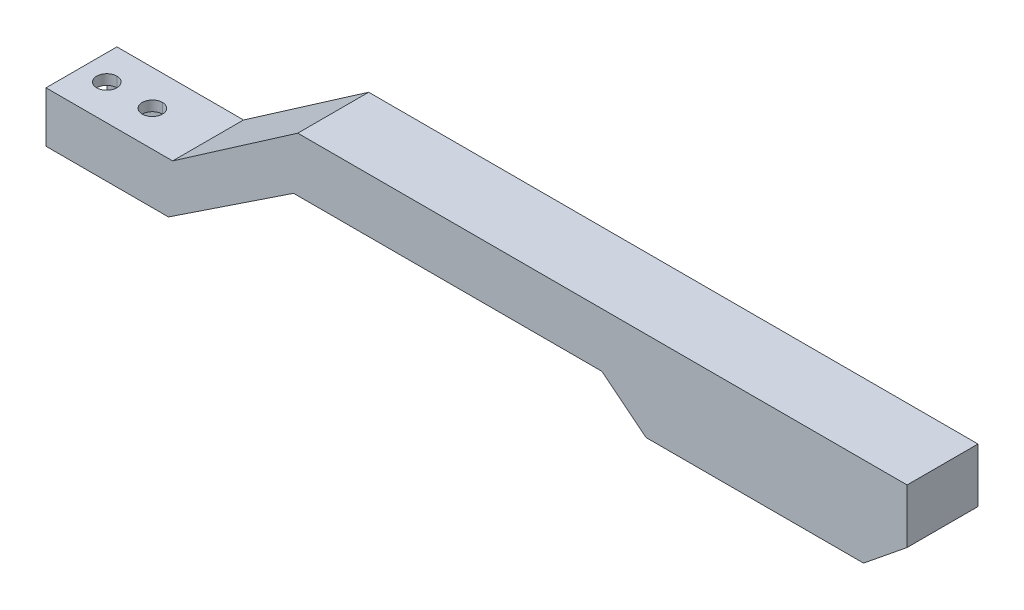
ISO-10303-21;
HEADER;
FILE_DESCRIPTION(('STEP AP214'),'2;1');
FILE_NAME('part.step','',(''),(''),'','','');
FILE_SCHEMA(('AUTOMOTIVE_DESIGN { 1 0 10303 214 1 1 1 1 }'));
ENDSEC;
DATA;
#1=APPLICATION_CONTEXT('core data for automotive mechanical design processes');
#2=APPLICATION_PROTOCOL_DEFINITION('international standard','automotive_design',2000,#1);
#3=PRODUCT_CONTEXT('',#1,'mechanical');
#4=PRODUCT('Part','Part','',(#3));
#5=PRODUCT_RELATED_PRODUCT_CATEGORY('part','',(#4));
#6=PRODUCT_DEFINITION_FORMATION('','',#4);
#7=PRODUCT_DEFINITION_CONTEXT('part definition',#1,'design');
#8=PRODUCT_DEFINITION('design','',#6,#7);
#9=PRODUCT_DEFINITION_SHAPE('','',#8);
#10=(LENGTH_UNIT() NAMED_UNIT(*) SI_UNIT(.MILLI.,.METRE.));
#11=(NAMED_UNIT(*) PLANE_ANGLE_UNIT() SI_UNIT($,.RADIAN.));
#12=(NAMED_UNIT(*) SI_UNIT($,.STERADIAN.) SOLID_ANGLE_UNIT());
#13=UNCERTAINTY_MEASURE_WITH_UNIT(LENGTH_MEASURE(1.E-05),#10,'distance_accuracy_value','');
#14=(GEOMETRIC_REPRESENTATION_CONTEXT(3) GLOBAL_UNCERTAINTY_ASSIGNED_CONTEXT((#13)) GLOBAL_UNIT_ASSIGNED_CONTEXT((#10,
#11,#12)) REPRESENTATION_CONTEXT('',''));
#15=CARTESIAN_POINT('',(0.,0.,0.));
#16=DIRECTION('',(0.,0.,1.));
#17=DIRECTION('',(1.,0.,0.));
#18=AXIS2_PLACEMENT_3D('',#15,#16,#17);
#19=CARTESIAN_POINT('',(-29.6828127219875,20.3064149639241,7.));
#20=DIRECTION('',(0.,1.,0.));
#21=DIRECTION('',(0.,0.,1.));
#22=AXIS2_PLACEMENT_3D('',#19,#20,#21);
#23=CYLINDRICAL_SURFACE('',#22,2.);
#24=DIRECTION('',(0.,1.,0.));
#25=VECTOR('',#24,1.);
#26=CARTESIAN_POINT('',(-29.6828127219875,20.3064149639241,5.));
#27=LINE('',#26,#25);
#28=CARTESIAN_POINT('',(-29.6828127219875,40.3064149639241,5.));
#29=VERTEX_POINT('',#28);
#30=CARTESIAN_POINT('',(-29.6828127219875,42.3064149639241,5.));
#31=VERTEX_POINT('',#30);
#32=EDGE_CURVE('E391',#29,#31,#27,.T.);
#33=ORIENTED_EDGE('',*,*,#32,.F.);
#34=CARTESIAN_POINT('',(-29.6828127219875,40.3064149639241,7.));
#35=DIRECTION('',(0.,1.,0.));
#36=DIRECTION('',(0.,0.,1.));
#37=AXIS2_PLACEMENT_3D('',#34,#35,#36);
#38=CIRCLE('',#37,2.);
#39=CARTESIAN_POINT('',(-29.6828127219875,40.3064149639241,9.));
#40=VERTEX_POINT('',#39);
#41=EDGE_CURVE('E290',#40,#29,#38,.T.);
#42=ORIENTED_EDGE('',*,*,#41,.F.);
#43=DIRECTION('',(0.,1.,0.));
#44=VECTOR('',#43,1.);
#45=CARTESIAN_POINT('',(-29.6828127219875,20.3064149639241,9.));
#46=LINE('',#45,#44);
#47=CARTESIAN_POINT('',(-29.6828127219875,42.3064149639241,9.));
#48=VERTEX_POINT('',#47);
#49=EDGE_CURVE('E380',#40,#48,#46,.T.);
#50=ORIENTED_EDGE('',*,*,#49,.T.);
#51=CARTESIAN_POINT('',(-29.6828127219875,42.3064149639241,7.));
#52=DIRECTION('',(0.,1.,0.));
#53=DIRECTION('',(0.,0.,1.));
#54=AXIS2_PLACEMENT_3D('',#51,#52,#53);
#55=CIRCLE('',#54,2.);
#56=EDGE_CURVE('E254',#48,#31,#55,.T.);
#57=ORIENTED_EDGE('',*,*,#56,.T.);
#58=EDGE_LOOP('',(#33,#42,#50,#57));
#59=FACE_BOUND('',#58,.T.);
#60=ADVANCED_FACE('F16',(#59),#23,.F.);
#61=CARTESIAN_POINT('',(-20.6828127219875,20.3064149639241,7.));
#62=DIRECTION('',(0.,1.,0.));
#63=DIRECTION('',(0.,0.,1.));
#64=AXIS2_PLACEMENT_3D('',#61,#62,#63);
#65=CYLINDRICAL_SURFACE('',#64,2.);
#66=DIRECTION('',(0.,1.,0.));
#67=VECTOR('',#66,1.);
#68=CARTESIAN_POINT('',(-20.6828127219875,20.3064149639241,5.));
#69=LINE('',#68,#67);
#70=CARTESIAN_POINT('',(-20.6828127219875,40.3064149639241,5.));
#71=VERTEX_POINT('',#70);
#72=CARTESIAN_POINT('',(-20.6828127219875,42.3064149639241,5.));
#73=VERTEX_POINT('',#72);
#74=EDGE_CURVE('E367',#71,#73,#69,.T.);
#75=ORIENTED_EDGE('',*,*,#74,.F.);
#76=CARTESIAN_POINT('',(-20.6828127219875,40.3064149639241,7.));
#77=DIRECTION('',(0.,1.,0.));
#78=DIRECTION('',(0.,0.,1.));
#79=AXIS2_PLACEMENT_3D('',#76,#77,#78);
#80=CIRCLE('',#79,2.);
#81=CARTESIAN_POINT('',(-20.6828127219875,40.3064149639241,9.));
#82=VERTEX_POINT('',#81);
#83=EDGE_CURVE('E25',#82,#71,#80,.T.);
#84=ORIENTED_EDGE('',*,*,#83,.F.);
#85=DIRECTION('',(0.,1.,0.));
#86=VECTOR('',#85,1.);
#87=CARTESIAN_POINT('',(-20.6828127219875,20.3064149639241,9.));
#88=LINE('',#87,#86);
#89=CARTESIAN_POINT('',(-20.6828127219875,42.3064149639241,9.));
#90=VERTEX_POINT('',#89);
#91=EDGE_CURVE('E218',#82,#90,#88,.T.);
#92=ORIENTED_EDGE('',*,*,#91,.T.);
#93=CARTESIAN_POINT('',(-20.6828127219875,42.3064149639241,7.));
#94=DIRECTION('',(0.,1.,0.));
#95=DIRECTION('',(0.,0.,1.));
#96=AXIS2_PLACEMENT_3D('',#93,#94,#95);
#97=CIRCLE('',#96,2.);
#98=EDGE_CURVE('E257',#90,#73,#97,.T.);
#99=ORIENTED_EDGE('',*,*,#98,.T.);
#100=EDGE_LOOP('',(#75,#84,#92,#99));
#101=FACE_BOUND('',#100,.T.);
#102=ADVANCED_FACE('F443',(#101),#65,.F.);
#103=CARTESIAN_POINT('',(-12.6828127219875,0.,0.));
#104=DIRECTION('',(1.,0.,0.));
#105=DIRECTION('',(0.,1.,0.));
#106=AXIS2_PLACEMENT_3D('',#103,#104,#105);
#107=PLANE('',#106);
#108=DIRECTION('',(0.,-1.,0.));
#109=VECTOR('',#108,1.);
#110=CARTESIAN_POINT('',(-12.6828127219875,32.3064149639241,2.));
#111=LINE('',#110,#109);
#112=CARTESIAN_POINT('',(-12.6828127219875,40.3064149639241,2.));
#113=VERTEX_POINT('',#112);
#114=CARTESIAN_POINT('',(-12.6828127219875,32.3064149639241,2.));
#115=VERTEX_POINT('',#114);
#116=EDGE_CURVE('E268',#113,#115,#111,.T.);
#117=ORIENTED_EDGE('',*,*,#116,.T.);
#118=DIRECTION('',(0.,0.,1.));
#119=VECTOR('',#118,1.);
#120=CARTESIAN_POINT('',(-12.6828127219875,32.3064149639241,2.));
#121=LINE('',#120,#119);
#122=CARTESIAN_POINT('',(-12.6828127219875,32.3064149639241,12.));
#123=VERTEX_POINT('',#122);
#124=EDGE_CURVE('E301',#115,#123,#121,.T.);
#125=ORIENTED_EDGE('',*,*,#124,.T.);
#126=DIRECTION('',(0.,1.,0.));
#127=VECTOR('',#126,1.);
#128=CARTESIAN_POINT('',(-12.6828127219875,40.3064149639241,12.));
#129=LINE('',#128,#127);
#130=CARTESIAN_POINT('',(-12.6828127219875,40.3064149639241,12.));
#131=VERTEX_POINT('',#130);
#132=EDGE_CURVE('E10',#123,#131,#129,.T.);
#133=ORIENTED_EDGE('',*,*,#132,.T.);
#134=DIRECTION('',(0.,0.,-1.));
#135=VECTOR('',#134,1.);
#136=CARTESIAN_POINT('',(-12.6828127219875,40.3064149639241,2.));
#137=LINE('',#136,#135);
#138=EDGE_CURVE('E48',#131,#113,#137,.T.);
#139=ORIENTED_EDGE('',*,*,#138,.T.);
#140=EDGE_LOOP('',(#117,#125,#133,#139));
#141=FACE_BOUND('',#140,.T.);
#142=ADVANCED_FACE('F448',(#141),#107,.F.);
#143=CARTESIAN_POINT('',(-12.6828127219875,40.3064149639241,12.));
#144=DIRECTION('',(0.,0.,1.));
#145=DIRECTION('',(0.,-1.,0.));
#146=AXIS2_PLACEMENT_3D('',#143,#144,#145);
#147=PLANE('',#146);
#148=DIRECTION('',(0.,1.,0.));
#149=VECTOR('',#148,1.);
#150=CARTESIAN_POINT('',(-34.6828127219876,40.3064149639241,12.));
#151=LINE('',#150,#149);
#152=CARTESIAN_POINT('',(-34.6828127219876,32.3064149639241,12.));
#153=VERTEX_POINT('',#152);
#154=CARTESIAN_POINT('',(-34.6828127219876,40.3064149639241,12.));
#155=VERTEX_POINT('',#154);
#156=EDGE_CURVE('E272',#153,#155,#151,.T.);
#157=ORIENTED_EDGE('',*,*,#156,.T.);
#158=DIRECTION('',(-1.,0.,0.));
#159=VECTOR('',#158,1.);
#160=CARTESIAN_POINT('',(-12.6828127219875,40.3064149639241,12.));
#161=LINE('',#160,#159);
#162=EDGE_CURVE('E19',#131,#155,#161,.T.);
#163=ORIENTED_EDGE('',*,*,#162,.F.);
#164=ORIENTED_EDGE('',*,*,#132,.F.);
#165=DIRECTION('',(-1.,0.,0.));
#166=VECTOR('',#165,1.);
#167=CARTESIAN_POINT('',(-12.6828127219875,32.3064149639241,12.));
#168=LINE('',#167,#166);
#169=EDGE_CURVE('E305',#123,#153,#168,.T.);
#170=ORIENTED_EDGE('',*,*,#169,.T.);
#171=EDGE_LOOP('',(#157,#163,#164,#170));
#172=FACE_BOUND('',#171,.T.);
#173=ADVANCED_FACE('F341',(#172),#147,.F.);
#174=CARTESIAN_POINT('',(-12.6828127219875,40.3064149639241,2.));
#175=DIRECTION('',(0.,1.,0.));
#176=DIRECTION('',(1.,0.,0.));
#177=AXIS2_PLACEMENT_3D('',#174,#175,#176);
#178=PLANE('',#177);
#179=ORIENTED_EDGE('',*,*,#83,.T.);
#180=CARTESIAN_POINT('',(-20.6828127219875,40.3064149639241,7.));
#181=DIRECTION('',(0.,1.,0.));
#182=DIRECTION('',(0.,0.,1.));
#183=AXIS2_PLACEMENT_3D('',#180,#181,#182);
#184=CIRCLE('',#183,2.);
#185=EDGE_CURVE('E371',#71,#82,#184,.T.);
#186=ORIENTED_EDGE('',*,*,#185,.T.);
#187=EDGE_LOOP('',(#179,#186));
#188=FACE_BOUND('',#187,.T.);
#189=ORIENTED_EDGE('',*,*,#41,.T.);
#190=CARTESIAN_POINT('',(-29.6828127219875,40.3064149639241,7.));
#191=DIRECTION('',(0.,1.,0.));
#192=DIRECTION('',(0.,0.,1.));
#193=AXIS2_PLACEMENT_3D('',#190,#191,#192);
#194=CIRCLE('',#193,2.);
#195=EDGE_CURVE('E401',#29,#40,#194,.T.);
#196=ORIENTED_EDGE('',*,*,#195,.T.);
#197=EDGE_LOOP('',(#189,#196));
#198=FACE_BOUND('',#197,.T.);
#199=DIRECTION('',(0.,0.,-1.));
#200=VECTOR('',#199,1.);
#201=CARTESIAN_POINT('',(-34.6828127219876,40.3064149639241,2.));
#202=LINE('',#201,#200);
#203=CARTESIAN_POINT('',(-34.6828127219876,40.3064149639241,2.));
#204=VERTEX_POINT('',#203);
#205=EDGE_CURVE('E264',#155,#204,#202,.T.);
#206=ORIENTED_EDGE('',*,*,#205,.T.);
#207=DIRECTION('',(-1.,0.,0.));
#208=VECTOR('',#207,1.);
#209=CARTESIAN_POINT('',(-12.6828127219875,40.3064149639241,2.));
#210=LINE('',#209,#208);
#211=EDGE_CURVE('E265',#113,#204,#210,.T.);
#212=ORIENTED_EDGE('',*,*,#211,.F.);
#213=ORIENTED_EDGE('',*,*,#138,.F.);
#214=ORIENTED_EDGE('',*,*,#162,.T.);
#215=EDGE_LOOP('',(#206,#212,#213,#214));
#216=FACE_BOUND('',#215,.T.);
#217=ADVANCED_FACE('F336',(#188,#198,#216),#178,.F.);
#218=CARTESIAN_POINT('',(-12.6828127219875,32.3064149639241,2.));
#219=DIRECTION('',(0.,0.,-1.));
#220=DIRECTION('',(0.,-1.,0.));
#221=AXIS2_PLACEMENT_3D('',#218,#219,#220);
#222=PLANE('',#221);
#223=DIRECTION('',(0.,-1.,0.));
#224=VECTOR('',#223,1.);
#225=CARTESIAN_POINT('',(-34.6828127219876,32.3064149639241,2.));
#226=LINE('',#225,#224);
#227=CARTESIAN_POINT('',(-34.6828127219876,32.3064149639241,2.));
#228=VERTEX_POINT('',#227);
#229=EDGE_CURVE('E260',#204,#228,#226,.T.);
#230=ORIENTED_EDGE('',*,*,#229,.T.);
#231=DIRECTION('',(-1.,0.,0.));
#232=VECTOR('',#231,1.);
#233=CARTESIAN_POINT('',(-12.6828127219875,32.3064149639241,2.));
#234=LINE('',#233,#232);
#235=EDGE_CURVE('E287',#115,#228,#234,.T.);
#236=ORIENTED_EDGE('',*,*,#235,.F.);
#237=ORIENTED_EDGE('',*,*,#116,.F.);
#238=ORIENTED_EDGE('',*,*,#211,.T.);
#239=EDGE_LOOP('',(#230,#236,#237,#238));
#240=FACE_BOUND('',#239,.T.);
#241=ADVANCED_FACE('F352',(#240),#222,.F.);
#242=CARTESIAN_POINT('',(0.,0.,0.));
#243=DIRECTION('',(0.,0.,-1.));
#244=DIRECTION('',(0.,-1.,0.));
#245=AXIS2_PLACEMENT_3D('',#242,#243,#244);
#246=PLANE('',#245);
#247=DIRECTION('',(-0.776775215923174,-0.62977794811148,0.));
#248=VECTOR('',#247,1.);
#249=CARTESIAN_POINT('',(135.317187278012,48.7028650030654,0.));
#250=LINE('',#249,#248);
#251=CARTESIAN_POINT('',(135.317187278012,48.7028650030654,0.));
#252=VERTEX_POINT('',#251);
#253=CARTESIAN_POINT('',(126.724313681544,41.7361104117342,0.));
#254=VERTEX_POINT('',#253);
#255=EDGE_CURVE('E189',#252,#254,#250,.T.);
#256=ORIENTED_EDGE('',*,*,#255,.T.);
#257=DIRECTION('',(-1.,0.,0.));
#258=VECTOR('',#257,1.);
#259=CARTESIAN_POINT('',(126.724313681544,41.7361104117342,0.));
#260=LINE('',#259,#258);
#261=CARTESIAN_POINT('',(83.7906879071486,41.7361104117342,0.));
#262=VERTEX_POINT('',#261);
#263=EDGE_CURVE('E182',#254,#262,#260,.T.);
#264=ORIENTED_EDGE('',*,*,#263,.T.);
#265=DIRECTION('',(-0.782540017600383,0.622600289795943,0.));
#266=VECTOR('',#265,1.);
#267=CARTESIAN_POINT('',(83.7906879071486,41.7361104117342,0.));
#268=LINE('',#267,#266);
#269=CARTESIAN_POINT('',(75.0342444074119,48.7028650030654,0.));
#270=VERTEX_POINT('',#269);
#271=EDGE_CURVE('E186',#262,#270,#268,.T.);
#272=ORIENTED_EDGE('',*,*,#271,.T.);
#273=DIRECTION('',(-1.,0.,0.));
#274=VECTOR('',#273,1.);
#275=CARTESIAN_POINT('',(75.0342444074119,48.7028650030654,0.));
#276=LINE('',#275,#274);
#277=CARTESIAN_POINT('',(14.1988837595748,48.7028650030654,0.));
#278=VERTEX_POINT('',#277);
#279=EDGE_CURVE('E322',#270,#278,#276,.T.);
#280=ORIENTED_EDGE('',*,*,#279,.T.);
#281=DIRECTION('',(-0.833222724572058,-0.55293751116805,0.));
#282=VECTOR('',#281,1.);
#283=CARTESIAN_POINT('',(14.1988837595748,48.7028650030654,0.));
#284=LINE('',#283,#282);
#285=CARTESIAN_POINT('',(-10.5089620620316,32.3064149639241,0.));
#286=VERTEX_POINT('',#285);
#287=EDGE_CURVE('E304',#278,#286,#284,.T.);
#288=ORIENTED_EDGE('',*,*,#287,.T.);
#289=DIRECTION('',(-1.,0.,0.));
#290=VECTOR('',#289,1.);
#291=CARTESIAN_POINT('',(-10.5089620620316,32.3064149639241,0.));
#292=LINE('',#291,#290);
#293=CARTESIAN_POINT('',(-34.6828127219876,32.3064149639241,0.));
#294=VERTEX_POINT('',#293);
#295=EDGE_CURVE('E292',#286,#294,#292,.T.);
#296=ORIENTED_EDGE('',*,*,#295,.T.);
#297=DIRECTION('',(0.,1.,0.));
#298=VECTOR('',#297,1.);
#299=CARTESIAN_POINT('',(-34.6828127219876,32.3064149639241,0.));
#300=LINE('',#299,#298);
#301=CARTESIAN_POINT('',(-34.6828127219876,42.3064149639241,0.));
#302=VERTEX_POINT('',#301);
#303=EDGE_CURVE('E280',#294,#302,#300,.T.);
#304=ORIENTED_EDGE('',*,*,#303,.T.);
#305=DIRECTION('',(1.,0.,0.));
#306=VECTOR('',#305,1.);
#307=CARTESIAN_POINT('',(-34.6828127219876,42.3064149639241,0.));
#308=LINE('',#307,#306);
#309=CARTESIAN_POINT('',(-9.68281272198753,42.3064149639241,0.));
#310=VERTEX_POINT('',#309);
#311=EDGE_CURVE('E243',#302,#310,#308,.T.);
#312=ORIENTED_EDGE('',*,*,#311,.T.);
#313=DIRECTION('',(-0.82229833816121,-0.569056625527998,0.));
#314=VECTOR('',#313,1.);
#315=CARTESIAN_POINT('',(15.0250330996188,59.4050307762218,0.));
#316=LINE('',#315,#314);
#317=CARTESIAN_POINT('',(15.0250330996188,59.4050307762218,0.));
#318=VERTEX_POINT('',#317);
#319=EDGE_CURVE('E234',#318,#310,#316,.T.);
#320=ORIENTED_EDGE('',*,*,#319,.F.);
#321=DIRECTION('',(-1.,0.,0.));
#322=VECTOR('',#321,1.);
#323=CARTESIAN_POINT('',(135.317187278012,59.4050307762218,0.));
#324=LINE('',#323,#322);
#325=CARTESIAN_POINT('',(135.317187278012,59.4050307762218,0.));
#326=VERTEX_POINT('',#325);
#327=EDGE_CURVE('E230',#326,#318,#324,.T.);
#328=ORIENTED_EDGE('',*,*,#327,.F.);
#329=DIRECTION('',(0.,1.,0.));
#330=VECTOR('',#329,1.);
#331=CARTESIAN_POINT('',(135.317187278012,48.7028650030654,0.));
#332=LINE('',#331,#330);
#333=EDGE_CURVE('E375',#252,#326,#332,.T.);
#334=ORIENTED_EDGE('',*,*,#333,.F.);
#335=EDGE_LOOP('',(#256,#264,#272,#280,#288,#296,#304,#312,#320,#328,#334));
#336=FACE_BOUND('',#335,.T.);
#337=ADVANCED_FACE('F184',(#336),#246,.T.);
#338=CARTESIAN_POINT('',(0.,0.,14.));
#339=DIRECTION('',(0.,0.,-1.));
#340=DIRECTION('',(0.,-1.,0.));
#341=AXIS2_PLACEMENT_3D('',#338,#339,#340);
#342=PLANE('',#341);
#343=DIRECTION('',(-0.776775215923174,-0.62977794811148,0.));
#344=VECTOR('',#343,1.);
#345=CARTESIAN_POINT('',(135.317187278012,48.7028650030654,14.));
#346=LINE('',#345,#344);
#347=CARTESIAN_POINT('',(135.317187278012,48.7028650030654,14.));
#348=VERTEX_POINT('',#347);
#349=CARTESIAN_POINT('',(126.724313681544,41.7361104117342,14.));
#350=VERTEX_POINT('',#349);
#351=EDGE_CURVE('E224',#348,#350,#346,.T.);
#352=ORIENTED_EDGE('',*,*,#351,.F.);
#353=DIRECTION('',(0.,1.,0.));
#354=VECTOR('',#353,1.);
#355=CARTESIAN_POINT('',(135.317187278012,52.442890251997,14.));
#356=LINE('',#355,#354);
#357=CARTESIAN_POINT('',(135.317187278012,59.4050307762218,14.));
#358=VERTEX_POINT('',#357);
#359=EDGE_CURVE('E362',#348,#358,#356,.T.);
#360=ORIENTED_EDGE('',*,*,#359,.T.);
#361=DIRECTION('',(-1.,0.,0.));
#362=VECTOR('',#361,1.);
#363=CARTESIAN_POINT('',(81.5224997059503,59.4050307762218,14.));
#364=LINE('',#363,#362);
#365=CARTESIAN_POINT('',(15.0250330996188,59.4050307762218,14.));
#366=VERTEX_POINT('',#365);
#367=EDGE_CURVE('E229',#358,#366,#364,.T.);
#368=ORIENTED_EDGE('',*,*,#367,.T.);
#369=DIRECTION('',(-0.82229833816121,-0.569056625527998,0.));
#370=VECTOR('',#369,1.);
#371=CARTESIAN_POINT('',(15.0250330996188,59.4050307762218,14.));
#372=LINE('',#371,#370);
#373=CARTESIAN_POINT('',(-9.68281272198753,42.3064149639241,14.));
#374=VERTEX_POINT('',#373);
#375=EDGE_CURVE('E239',#366,#374,#372,.T.);
#376=ORIENTED_EDGE('',*,*,#375,.T.);
#377=DIRECTION('',(1.,0.,0.));
#378=VECTOR('',#377,1.);
#379=CARTESIAN_POINT('',(-34.6828127219876,42.3064149639241,14.));
#380=LINE('',#379,#378);
#381=CARTESIAN_POINT('',(-34.6828127219876,42.3064149639241,14.));
#382=VERTEX_POINT('',#381);
#383=EDGE_CURVE('E251',#382,#374,#380,.T.);
#384=ORIENTED_EDGE('',*,*,#383,.F.);
#385=DIRECTION('',(0.,1.,0.));
#386=VECTOR('',#385,1.);
#387=CARTESIAN_POINT('',(-34.6828127219876,32.3064149639241,14.));
#388=LINE('',#387,#386);
#389=CARTESIAN_POINT('',(-34.6828127219876,32.3064149639241,14.));
#390=VERTEX_POINT('',#389);
#391=EDGE_CURVE('E277',#390,#382,#388,.T.);
#392=ORIENTED_EDGE('',*,*,#391,.F.);
#393=DIRECTION('',(-1.,0.,0.));
#394=VECTOR('',#393,1.);
#395=CARTESIAN_POINT('',(-10.5089620620316,32.3064149639241,14.));
#396=LINE('',#395,#394);
#397=CARTESIAN_POINT('',(-10.5089620620316,32.3064149639241,14.));
#398=VERTEX_POINT('',#397);
#399=EDGE_CURVE('E300',#398,#390,#396,.T.);
#400=ORIENTED_EDGE('',*,*,#399,.F.);
#401=DIRECTION('',(-0.833222724572058,-0.55293751116805,0.));
#402=VECTOR('',#401,1.);
#403=CARTESIAN_POINT('',(14.1988837595748,48.7028650030654,14.));
#404=LINE('',#403,#402);
#405=CARTESIAN_POINT('',(14.1988837595748,48.7028650030654,14.));
#406=VERTEX_POINT('',#405);
#407=EDGE_CURVE('E319',#406,#398,#404,.T.);
#408=ORIENTED_EDGE('',*,*,#407,.F.);
#409=DIRECTION('',(-1.,0.,0.));
#410=VECTOR('',#409,1.);
#411=CARTESIAN_POINT('',(75.0342444074119,48.7028650030654,14.));
#412=LINE('',#411,#410);
#413=CARTESIAN_POINT('',(75.0342444074119,48.7028650030654,14.));
#414=VERTEX_POINT('',#413);
#415=EDGE_CURVE('E209',#414,#406,#412,.T.);
#416=ORIENTED_EDGE('',*,*,#415,.F.);
#417=DIRECTION('',(-0.782540017600383,0.622600289795943,0.));
#418=VECTOR('',#417,1.);
#419=CARTESIAN_POINT('',(83.7906879071486,41.7361104117342,14.));
#420=LINE('',#419,#418);
#421=CARTESIAN_POINT('',(83.7906879071486,41.7361104117342,14.));
#422=VERTEX_POINT('',#421);
#423=EDGE_CURVE('E195',#422,#414,#420,.T.);
#424=ORIENTED_EDGE('',*,*,#423,.F.);
#425=DIRECTION('',(-1.,0.,0.));
#426=VECTOR('',#425,1.);
#427=CARTESIAN_POINT('',(126.724313681544,41.7361104117342,14.));
#428=LINE('',#427,#426);
#429=EDGE_CURVE('E194',#350,#422,#428,.T.);
#430=ORIENTED_EDGE('',*,*,#429,.F.);
#431=EDGE_LOOP('',(#352,#360,#368,#376,#384,#392,#400,#408,#416,#424,#430));
#432=FACE_BOUND('',#431,.T.);
#433=ADVANCED_FACE('F425',(#432),#342,.F.);
#434=CARTESIAN_POINT('',(126.724313681544,41.7361104117342,14.));
#435=DIRECTION('',(0.,-1.,0.));
#436=DIRECTION('',(0.,0.,-1.));
#437=AXIS2_PLACEMENT_3D('',#434,#435,#436);
#438=PLANE('',#437);
#439=ORIENTED_EDGE('',*,*,#263,.F.);
#440=DIRECTION('',(0.,0.,-1.));
#441=VECTOR('',#440,1.);
#442=CARTESIAN_POINT('',(126.724313681544,41.7361104117342,14.));
#443=LINE('',#442,#441);
#444=EDGE_CURVE('E385',#350,#254,#443,.T.);
#445=ORIENTED_EDGE('',*,*,#444,.F.);
#446=ORIENTED_EDGE('',*,*,#429,.T.);
#447=DIRECTION('',(0.,0.,-1.));
#448=VECTOR('',#447,1.);
#449=CARTESIAN_POINT('',(83.7906879071486,41.7361104117342,14.));
#450=LINE('',#449,#448);
#451=EDGE_CURVE('E198',#422,#262,#450,.T.);
#452=ORIENTED_EDGE('',*,*,#451,.T.);
#453=EDGE_LOOP('',(#439,#445,#446,#452));
#454=FACE_BOUND('',#453,.T.);
#455=ADVANCED_FACE('F199',(#454),#438,.T.);
#456=CARTESIAN_POINT('',(83.7906879071486,41.7361104117342,14.));
#457=DIRECTION('',(-0.622600289795943,-0.782540017600383,0.));
#458=DIRECTION('',(-0.782540017600383,0.622600289795943,0.));
#459=AXIS2_PLACEMENT_3D('',#456,#457,#458);
#460=PLANE('',#459);
#461=ORIENTED_EDGE('',*,*,#271,.F.);
#462=ORIENTED_EDGE('',*,*,#451,.F.);
#463=ORIENTED_EDGE('',*,*,#423,.T.);
#464=DIRECTION('',(0.,0.,-1.));
#465=VECTOR('',#464,1.);
#466=CARTESIAN_POINT('',(75.0342444074119,48.7028650030654,14.));
#467=LINE('',#466,#465);
#468=EDGE_CURVE('E206',#414,#270,#467,.T.);
#469=ORIENTED_EDGE('',*,*,#468,.T.);
#470=EDGE_LOOP('',(#461,#462,#463,#469));
#471=FACE_BOUND('',#470,.T.);
#472=ADVANCED_FACE('F204',(#471),#460,.T.);
#473=CARTESIAN_POINT('',(75.0342444074119,48.7028650030654,14.));
#474=DIRECTION('',(0.,-1.,0.));
#475=DIRECTION('',(0.,0.,-1.));
#476=AXIS2_PLACEMENT_3D('',#473,#474,#475);
#477=PLANE('',#476);
#478=ORIENTED_EDGE('',*,*,#279,.F.);
#479=ORIENTED_EDGE('',*,*,#468,.F.);
#480=ORIENTED_EDGE('',*,*,#415,.T.);
#481=DIRECTION('',(0.,0.,-1.));
#482=VECTOR('',#481,1.);
#483=CARTESIAN_POINT('',(14.1988837595748,48.7028650030654,14.));
#484=LINE('',#483,#482);
#485=EDGE_CURVE('E313',#406,#278,#484,.T.);
#486=ORIENTED_EDGE('',*,*,#485,.T.);
#487=EDGE_LOOP('',(#478,#479,#480,#486));
#488=FACE_BOUND('',#487,.T.);
#489=ADVANCED_FACE('F556',(#488),#477,.T.);
#490=CARTESIAN_POINT('',(14.1988837595748,48.7028650030654,14.));
#491=DIRECTION('',(0.55293751116805,-0.833222724572058,0.));
#492=DIRECTION('',(0.,0.,-1.));
#493=AXIS2_PLACEMENT_3D('',#490,#491,#492);
#494=PLANE('',#493);
#495=ORIENTED_EDGE('',*,*,#287,.F.);
#496=ORIENTED_EDGE('',*,*,#485,.F.);
#497=ORIENTED_EDGE('',*,*,#407,.T.);
#498=DIRECTION('',(0.,0.,-1.));
#499=VECTOR('',#498,1.);
#500=CARTESIAN_POINT('',(-10.5089620620316,32.3064149639241,14.));
#501=LINE('',#500,#499);
#502=EDGE_CURVE('E296',#398,#286,#501,.T.);
#503=ORIENTED_EDGE('',*,*,#502,.T.);
#504=EDGE_LOOP('',(#495,#496,#497,#503));
#505=FACE_BOUND('',#504,.T.);
#506=ADVANCED_FACE('F550',(#505),#494,.T.);
#507=CARTESIAN_POINT('',(-10.5089620620316,32.3064149639241,14.));
#508=DIRECTION('',(0.,-1.,0.));
#509=DIRECTION('',(-1.,0.,0.));
#510=AXIS2_PLACEMENT_3D('',#507,#508,#509);
#511=PLANE('',#510);
#512=ORIENTED_EDGE('',*,*,#235,.T.);
#513=DIRECTION('',(0.,0.,-1.));
#514=VECTOR('',#513,1.);
#515=CARTESIAN_POINT('',(-34.6828127219876,32.3064149639241,14.));
#516=LINE('',#515,#514);
#517=EDGE_CURVE('E283',#228,#294,#516,.T.);
#518=ORIENTED_EDGE('',*,*,#517,.T.);
#519=ORIENTED_EDGE('',*,*,#295,.F.);
#520=ORIENTED_EDGE('',*,*,#502,.F.);
#521=ORIENTED_EDGE('',*,*,#399,.T.);
#522=DIRECTION('',(0.,0.,-1.));
#523=VECTOR('',#522,1.);
#524=CARTESIAN_POINT('',(-34.6828127219876,32.3064149639241,14.));
#525=LINE('',#524,#523);
#526=EDGE_CURVE('E273',#390,#153,#525,.T.);
#527=ORIENTED_EDGE('',*,*,#526,.T.);
#528=ORIENTED_EDGE('',*,*,#169,.F.);
#529=ORIENTED_EDGE('',*,*,#124,.F.);
#530=EDGE_LOOP('',(#512,#518,#519,#520,#521,#527,#528,#529));
#531=FACE_BOUND('',#530,.T.);
#532=ADVANCED_FACE('F555',(#531),#511,.T.);
#533=CARTESIAN_POINT('',(-34.6828127219876,32.3064149639241,14.));
#534=DIRECTION('',(-1.,0.,0.));
#535=DIRECTION('',(0.,0.,1.));
#536=AXIS2_PLACEMENT_3D('',#533,#534,#535);
#537=PLANE('',#536);
#538=ORIENTED_EDGE('',*,*,#229,.F.);
#539=ORIENTED_EDGE('',*,*,#205,.F.);
#540=ORIENTED_EDGE('',*,*,#156,.F.);
#541=ORIENTED_EDGE('',*,*,#526,.F.);
#542=ORIENTED_EDGE('',*,*,#391,.T.);
#543=DIRECTION('',(0.,0.,-1.));
#544=VECTOR('',#543,1.);
#545=CARTESIAN_POINT('',(-34.6828127219876,42.3064149639241,14.));
#546=LINE('',#545,#544);
#547=EDGE_CURVE('E247',#382,#302,#546,.T.);
#548=ORIENTED_EDGE('',*,*,#547,.T.);
#549=ORIENTED_EDGE('',*,*,#303,.F.);
#550=ORIENTED_EDGE('',*,*,#517,.F.);
#551=EDGE_LOOP('',(#538,#539,#540,#541,#542,#548,#549,#550));
#552=FACE_BOUND('',#551,.T.);
#553=ADVANCED_FACE('F347',(#552),#537,.T.);
#554=CARTESIAN_POINT('',(-34.6828127219876,42.3064149639241,14.));
#555=DIRECTION('',(0.,1.,0.));
#556=DIRECTION('',(1.,0.,0.));
#557=AXIS2_PLACEMENT_3D('',#554,#555,#556);
#558=PLANE('',#557);
#559=ORIENTED_EDGE('',*,*,#98,.F.);
#560=CARTESIAN_POINT('',(-20.6828127219875,42.3064149639241,7.));
#561=DIRECTION('',(0.,1.,0.));
#562=DIRECTION('',(0.,0.,1.));
#563=AXIS2_PLACEMENT_3D('',#560,#561,#562);
#564=CIRCLE('',#563,2.);
#565=EDGE_CURVE('E363',#73,#90,#564,.T.);
#566=ORIENTED_EDGE('',*,*,#565,.F.);
#567=EDGE_LOOP('',(#559,#566));
#568=FACE_BOUND('',#567,.T.);
#569=ORIENTED_EDGE('',*,*,#56,.F.);
#570=CARTESIAN_POINT('',(-29.6828127219875,42.3064149639241,7.));
#571=DIRECTION('',(0.,1.,0.));
#572=DIRECTION('',(0.,0.,1.));
#573=AXIS2_PLACEMENT_3D('',#570,#571,#572);
#574=CIRCLE('',#573,2.);
#575=EDGE_CURVE('E384',#31,#48,#574,.T.);
#576=ORIENTED_EDGE('',*,*,#575,.F.);
#577=EDGE_LOOP('',(#569,#576));
#578=FACE_BOUND('',#577,.T.);
#579=ORIENTED_EDGE('',*,*,#311,.F.);
#580=ORIENTED_EDGE('',*,*,#547,.F.);
#581=ORIENTED_EDGE('',*,*,#383,.T.);
#582=DIRECTION('',(0.,0.,-1.));
#583=VECTOR('',#582,1.);
#584=CARTESIAN_POINT('',(-9.68281272198753,42.3064149639241,14.));
#585=LINE('',#584,#583);
#586=EDGE_CURVE('E238',#374,#310,#585,.T.);
#587=ORIENTED_EDGE('',*,*,#586,.T.);
#588=EDGE_LOOP('',(#579,#580,#581,#587));
#589=FACE_BOUND('',#588,.T.);
#590=ADVANCED_FACE('F580',(#568,#578,#589),#558,.T.);
#591=CARTESIAN_POINT('',(15.0250330996188,59.4050307762218,14.));
#592=DIRECTION('',(0.569056625527998,-0.82229833816121,0.));
#593=DIRECTION('',(0.,0.,-1.));
#594=AXIS2_PLACEMENT_3D('',#591,#592,#593);
#595=PLANE('',#594);
#596=ORIENTED_EDGE('',*,*,#319,.T.);
#597=ORIENTED_EDGE('',*,*,#586,.F.);
#598=ORIENTED_EDGE('',*,*,#375,.F.);
#599=DIRECTION('',(0.,0.,-1.));
#600=VECTOR('',#599,1.);
#601=CARTESIAN_POINT('',(15.0250330996188,59.4050307762218,14.));
#602=LINE('',#601,#600);
#603=EDGE_CURVE('E225',#366,#318,#602,.T.);
#604=ORIENTED_EDGE('',*,*,#603,.T.);
#605=EDGE_LOOP('',(#596,#597,#598,#604));
#606=FACE_BOUND('',#605,.T.);
#607=ADVANCED_FACE('F575',(#606),#595,.F.);
#608=CARTESIAN_POINT('',(135.317187278012,59.4050307762218,14.));
#609=DIRECTION('',(0.,-1.,0.));
#610=DIRECTION('',(0.,0.,-1.));
#611=AXIS2_PLACEMENT_3D('',#608,#609,#610);
#612=PLANE('',#611);
#613=ORIENTED_EDGE('',*,*,#327,.T.);
#614=ORIENTED_EDGE('',*,*,#603,.F.);
#615=ORIENTED_EDGE('',*,*,#367,.F.);
#616=DIRECTION('',(0.,0.,-1.));
#617=VECTOR('',#616,1.);
#618=CARTESIAN_POINT('',(135.317187278012,59.4050307762218,14.));
#619=LINE('',#618,#617);
#620=EDGE_CURVE('E372',#358,#326,#619,.T.);
#621=ORIENTED_EDGE('',*,*,#620,.T.);
#622=EDGE_LOOP('',(#613,#614,#615,#621));
#623=FACE_BOUND('',#622,.T.);
#624=ADVANCED_FACE('F422',(#623),#612,.F.);
#625=CARTESIAN_POINT('',(135.317187278012,48.7028650030654,14.));
#626=DIRECTION('',(-1.,0.,0.));
#627=DIRECTION('',(0.,0.,1.));
#628=AXIS2_PLACEMENT_3D('',#625,#626,#627);
#629=PLANE('',#628);
#630=ORIENTED_EDGE('',*,*,#333,.T.);
#631=ORIENTED_EDGE('',*,*,#620,.F.);
#632=ORIENTED_EDGE('',*,*,#359,.F.);
#633=DIRECTION('',(0.,0.,-1.));
#634=VECTOR('',#633,1.);
#635=CARTESIAN_POINT('',(135.317187278012,48.7028650030654,14.));
#636=LINE('',#635,#634);
#637=EDGE_CURVE('E220',#348,#252,#636,.T.);
#638=ORIENTED_EDGE('',*,*,#637,.T.);
#639=EDGE_LOOP('',(#630,#631,#632,#638));
#640=FACE_BOUND('',#639,.T.);
#641=ADVANCED_FACE('F418',(#640),#629,.F.);
#642=CARTESIAN_POINT('',(135.317187278012,48.7028650030654,14.));
#643=DIRECTION('',(0.62977794811148,-0.776775215923174,0.));
#644=DIRECTION('',(0.,0.,-1.));
#645=AXIS2_PLACEMENT_3D('',#642,#643,#644);
#646=PLANE('',#645);
#647=ORIENTED_EDGE('',*,*,#255,.F.);
#648=ORIENTED_EDGE('',*,*,#637,.F.);
#649=ORIENTED_EDGE('',*,*,#351,.T.);
#650=ORIENTED_EDGE('',*,*,#444,.T.);
#651=EDGE_LOOP('',(#647,#648,#649,#650));
#652=FACE_BOUND('',#651,.T.);
#653=ADVANCED_FACE('F427',(#652),#646,.T.);
#654=CARTESIAN_POINT('',(-20.6828127219875,20.3064149639241,7.));
#655=DIRECTION('',(0.,1.,0.));
#656=DIRECTION('',(0.,0.,1.));
#657=AXIS2_PLACEMENT_3D('',#654,#655,#656);
#658=CYLINDRICAL_SURFACE('',#657,2.);
#659=ORIENTED_EDGE('',*,*,#185,.F.);
#660=ORIENTED_EDGE('',*,*,#74,.T.);
#661=ORIENTED_EDGE('',*,*,#565,.T.);
#662=ORIENTED_EDGE('',*,*,#91,.F.);
#663=EDGE_LOOP('',(#659,#660,#661,#662));
#664=FACE_BOUND('',#663,.T.);
#665=ADVANCED_FACE('F429',(#664),#658,.F.);
#666=CARTESIAN_POINT('',(-29.6828127219875,20.3064149639241,7.));
#667=DIRECTION('',(0.,1.,0.));
#668=DIRECTION('',(0.,0.,1.));
#669=AXIS2_PLACEMENT_3D('',#666,#667,#668);
#670=CYLINDRICAL_SURFACE('',#669,2.);
#671=ORIENTED_EDGE('',*,*,#195,.F.);
#672=ORIENTED_EDGE('',*,*,#32,.T.);
#673=ORIENTED_EDGE('',*,*,#575,.T.);
#674=ORIENTED_EDGE('',*,*,#49,.F.);
#675=EDGE_LOOP('',(#671,#672,#673,#674));
#676=FACE_BOUND('',#675,.T.);
#677=ADVANCED_FACE('F436',(#676),#670,.F.);
#678=CLOSED_SHELL('',(#60,#102,#142,#173,#217,#241,#337,#433,#455,#472,#489,#506,#532,#553,#590,
#607,#624,#641,#653,#665,#677));
#679=MANIFOLD_SOLID_BREP('B1',#678);
#680=ADVANCED_BREP_SHAPE_REPRESENTATION('',(#18,#679),#14);
#681=SHAPE_DEFINITION_REPRESENTATION(#9,#680);
ENDSEC;
END-ISO-10303-21;
